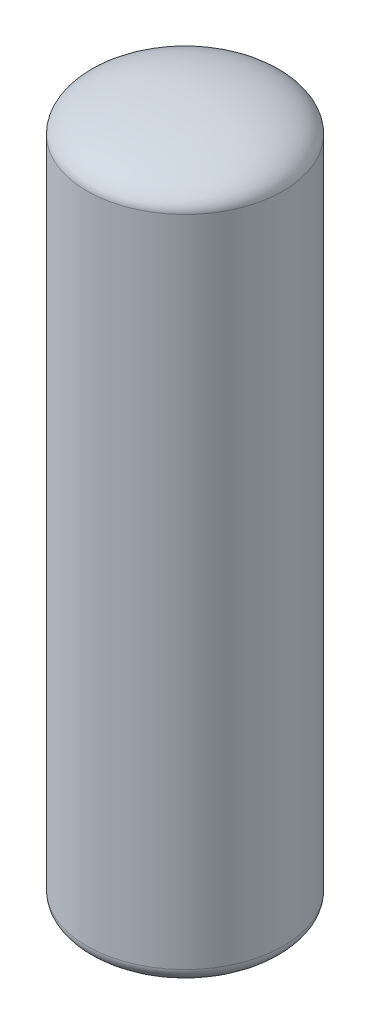
ISO-10303-21;
HEADER;
FILE_DESCRIPTION(('STEP AP214'),'2;1');
FILE_NAME('part.step','',(''),(''),'','','');
FILE_SCHEMA(('AUTOMOTIVE_DESIGN { 1 0 10303 214 1 1 1 1 }'));
ENDSEC;
DATA;
#1=APPLICATION_CONTEXT('core data for automotive mechanical design processes');
#2=APPLICATION_PROTOCOL_DEFINITION('international standard','automotive_design',2000,#1);
#3=PRODUCT_CONTEXT('',#1,'mechanical');
#4=PRODUCT('Part','Part','',(#3));
#5=PRODUCT_RELATED_PRODUCT_CATEGORY('part','',(#4));
#6=PRODUCT_DEFINITION_FORMATION('','',#4);
#7=PRODUCT_DEFINITION_CONTEXT('part definition',#1,'design');
#8=PRODUCT_DEFINITION('design','',#6,#7);
#9=PRODUCT_DEFINITION_SHAPE('','',#8);
#10=(LENGTH_UNIT() NAMED_UNIT(*) SI_UNIT(.MILLI.,.METRE.));
#11=(NAMED_UNIT(*) PLANE_ANGLE_UNIT() SI_UNIT($,.RADIAN.));
#12=(NAMED_UNIT(*) SI_UNIT($,.STERADIAN.) SOLID_ANGLE_UNIT());
#13=UNCERTAINTY_MEASURE_WITH_UNIT(LENGTH_MEASURE(1.E-05),#10,'distance_accuracy_value','');
#14=(GEOMETRIC_REPRESENTATION_CONTEXT(3) GLOBAL_UNCERTAINTY_ASSIGNED_CONTEXT((#13)) GLOBAL_UNIT_ASSIGNED_CONTEXT((#10,
#11,#12)) REPRESENTATION_CONTEXT('',''));
#15=CARTESIAN_POINT('',(0.,0.,0.));
#16=DIRECTION('',(0.,0.,1.));
#17=DIRECTION('',(1.,0.,0.));
#18=AXIS2_PLACEMENT_3D('',#15,#16,#17);
#19=CARTESIAN_POINT('',(0.,20.,0.));
#20=DIRECTION('',(0.,-1.,0.));
#21=DIRECTION('',(0.,0.,-1.));
#22=AXIS2_PLACEMENT_3D('',#19,#20,#21);
#23=CYLINDRICAL_SURFACE('',#22,3.);
#24=CARTESIAN_POINT('',(0.,20.,0.));
#25=DIRECTION('',(0.,1.,0.));
#26=DIRECTION('',(0.,0.,1.));
#27=AXIS2_PLACEMENT_3D('',#24,#25,#26);
#28=CIRCLE('',#27,3.);
#29=CARTESIAN_POINT('',(0.,20.,3.));
#30=VERTEX_POINT('',#29);
#31=EDGE_CURVE('E11',#30,#30,#28,.T.);
#32=ORIENTED_EDGE('',*,*,#31,.F.);
#33=EDGE_LOOP('',(#32));
#34=FACE_BOUND('',#33,.T.);
#35=CARTESIAN_POINT('',(0.,0.,0.));
#36=DIRECTION('',(0.,1.,0.));
#37=DIRECTION('',(0.,0.,1.));
#38=AXIS2_PLACEMENT_3D('',#35,#36,#37);
#39=CIRCLE('',#38,3.);
#40=CARTESIAN_POINT('',(0.,0.,3.));
#41=VERTEX_POINT('',#40);
#42=EDGE_CURVE('E42',#41,#41,#39,.T.);
#43=ORIENTED_EDGE('',*,*,#42,.T.);
#44=EDGE_LOOP('',(#43));
#45=FACE_BOUND('',#44,.T.);
#46=ADVANCED_FACE('F33',(#34,#45),#23,.T.);
#47=CARTESIAN_POINT('',(0.,20.,0.));
#48=DIRECTION('',(1.,0.,0.));
#49=DIRECTION('',(0.,0.,1.));
#50=AXIS2_PLACEMENT_3D('',#47,#48,#49);
#51=ELLIPSE('',#50,3.,1.);
#52=TRIMMED_CURVE('',#51,(PARAMETER_VALUE(4.71238898038469)),
(PARAMETER_VALUE(7.85398163397448)),.T.,.PARAMETER.);
#53=CARTESIAN_POINT('',(0.,19.,0.));
#54=DIRECTION('',(0.,1.,0.));
#55=AXIS1_PLACEMENT('',#53,#54);
#56=SURFACE_OF_REVOLUTION('',#52,#55);
#57=CARTESIAN_POINT('',(0.,21.,0.));
#58=VERTEX_POINT('',#57);
#59=VERTEX_LOOP('',#58);
#60=FACE_BOUND('',#59,.T.);
#61=ORIENTED_EDGE('',*,*,#31,.T.);
#62=EDGE_LOOP('',(#61));
#63=FACE_BOUND('',#62,.T.);
#64=ADVANCED_FACE('F49',(#60,#63),#56,.F.);
#65=CARTESIAN_POINT('',(0.,0.,0.));
#66=DIRECTION('',(-1.,0.,0.));
#67=DIRECTION('',(0.,0.,1.));
#68=AXIS2_PLACEMENT_3D('',#65,#66,#67);
#69=ELLIPSE('',#68,3.,1.);
#70=TRIMMED_CURVE('',#69,(PARAMETER_VALUE(4.71238898038469)),
(PARAMETER_VALUE(7.85398163397448)),.T.,.PARAMETER.);
#71=CARTESIAN_POINT('',(0.,1.,0.));
#72=DIRECTION('',(0.,-1.,0.));
#73=AXIS1_PLACEMENT('',#71,#72);
#74=SURFACE_OF_REVOLUTION('',#70,#73);
#75=CARTESIAN_POINT('',(0.,-1.,0.));
#76=VERTEX_POINT('',#75);
#77=VERTEX_LOOP('',#76);
#78=FACE_BOUND('',#77,.T.);
#79=ORIENTED_EDGE('',*,*,#42,.F.);
#80=EDGE_LOOP('',(#79));
#81=FACE_BOUND('',#80,.T.);
#82=ADVANCED_FACE('F35',(#78,#81),#74,.F.);
#83=CLOSED_SHELL('',(#46,#64,#82));
#84=MANIFOLD_SOLID_BREP('B2',#83);
#85=ADVANCED_BREP_SHAPE_REPRESENTATION('',(#18,#84),#14);
#86=SHAPE_DEFINITION_REPRESENTATION(#9,#85);
ENDSEC;
END-ISO-10303-21;
